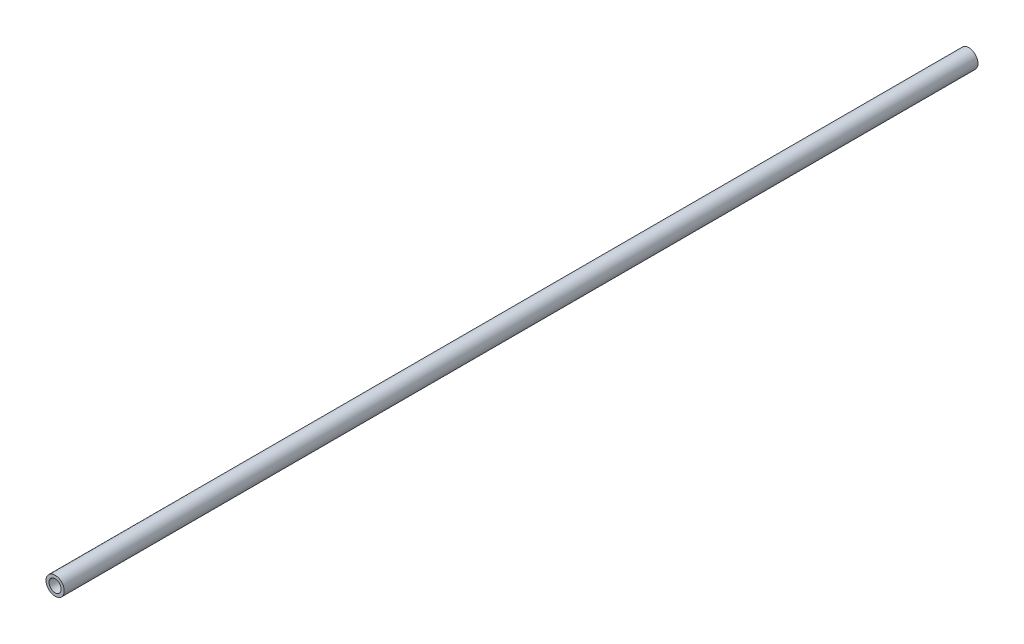
ISO-10303-21;
HEADER;
FILE_DESCRIPTION(('STEP AP214'),'2;1');
FILE_NAME('part.step','',(''),(''),'','','');
FILE_SCHEMA(('AUTOMOTIVE_DESIGN { 1 0 10303 214 1 1 1 1 }'));
ENDSEC;
DATA;
#1=APPLICATION_CONTEXT('core data for automotive mechanical design processes');
#2=APPLICATION_PROTOCOL_DEFINITION('international standard','automotive_design',2000,#1);
#3=PRODUCT_CONTEXT('',#1,'mechanical');
#4=PRODUCT('Part','Part','',(#3));
#5=PRODUCT_RELATED_PRODUCT_CATEGORY('part','',(#4));
#6=PRODUCT_DEFINITION_FORMATION('','',#4);
#7=PRODUCT_DEFINITION_CONTEXT('part definition',#1,'design');
#8=PRODUCT_DEFINITION('design','',#6,#7);
#9=PRODUCT_DEFINITION_SHAPE('','',#8);
#10=(LENGTH_UNIT() NAMED_UNIT(*) SI_UNIT(.MILLI.,.METRE.));
#11=(NAMED_UNIT(*) PLANE_ANGLE_UNIT() SI_UNIT($,.RADIAN.));
#12=(NAMED_UNIT(*) SI_UNIT($,.STERADIAN.) SOLID_ANGLE_UNIT());
#13=UNCERTAINTY_MEASURE_WITH_UNIT(LENGTH_MEASURE(1.E-05),#10,'distance_accuracy_value','');
#14=(GEOMETRIC_REPRESENTATION_CONTEXT(3) GLOBAL_UNCERTAINTY_ASSIGNED_CONTEXT((#13)) GLOBAL_UNIT_ASSIGNED_CONTEXT((#10,
#11,#12)) REPRESENTATION_CONTEXT('',''));
#15=CARTESIAN_POINT('',(0.,0.,0.));
#16=DIRECTION('',(0.,0.,1.));
#17=DIRECTION('',(1.,0.,0.));
#18=AXIS2_PLACEMENT_3D('',#15,#16,#17);
#19=CARTESIAN_POINT('',(0.,0.,300.));
#20=DIRECTION('',(0.,0.,1.));
#21=DIRECTION('',(1.,0.,0.));
#22=AXIS2_PLACEMENT_3D('',#19,#20,#21);
#23=PLANE('',#22);
#24=CARTESIAN_POINT('',(0.,0.,300.));
#25=DIRECTION('',(0.,0.,1.));
#26=DIRECTION('',(1.,0.,0.));
#27=AXIS2_PLACEMENT_3D('',#24,#25,#26);
#28=CIRCLE('',#27,3.);
#29=CARTESIAN_POINT('',(3.,0.,300.));
#30=VERTEX_POINT('',#29);
#31=EDGE_CURVE('E10',#30,#30,#28,.T.);
#32=ORIENTED_EDGE('',*,*,#31,.T.);
#33=EDGE_LOOP('',(#32));
#34=FACE_BOUND('',#33,.T.);
#35=CARTESIAN_POINT('',(0.,0.,300.));
#36=DIRECTION('',(0.,0.,1.));
#37=DIRECTION('',(1.,0.,0.));
#38=AXIS2_PLACEMENT_3D('',#35,#36,#37);
#39=CIRCLE('',#38,2.);
#40=CARTESIAN_POINT('',(2.,0.,300.));
#41=VERTEX_POINT('',#40);
#42=EDGE_CURVE('E43',#41,#41,#39,.T.);
#43=ORIENTED_EDGE('',*,*,#42,.F.);
#44=EDGE_LOOP('',(#43));
#45=FACE_BOUND('',#44,.T.);
#46=ADVANCED_FACE('F32',(#34,#45),#23,.T.);
#47=CARTESIAN_POINT('',(0.,0.,0.));
#48=DIRECTION('',(0.,0.,1.));
#49=DIRECTION('',(1.,0.,0.));
#50=AXIS2_PLACEMENT_3D('',#47,#48,#49);
#51=PLANE('',#50);
#52=CARTESIAN_POINT('',(0.,0.,0.));
#53=DIRECTION('',(0.,0.,1.));
#54=DIRECTION('',(1.,0.,0.));
#55=AXIS2_PLACEMENT_3D('',#52,#53,#54);
#56=CIRCLE('',#55,3.);
#57=CARTESIAN_POINT('',(3.,0.,0.));
#58=VERTEX_POINT('',#57);
#59=EDGE_CURVE('E36',#58,#58,#56,.T.);
#60=ORIENTED_EDGE('',*,*,#59,.F.);
#61=EDGE_LOOP('',(#60));
#62=FACE_BOUND('',#61,.T.);
#63=CARTESIAN_POINT('',(0.,0.,0.));
#64=DIRECTION('',(0.,0.,1.));
#65=DIRECTION('',(1.,0.,0.));
#66=AXIS2_PLACEMENT_3D('',#63,#64,#65);
#67=CIRCLE('',#66,2.);
#68=CARTESIAN_POINT('',(2.,0.,0.));
#69=VERTEX_POINT('',#68);
#70=EDGE_CURVE('E45',#69,#69,#67,.T.);
#71=ORIENTED_EDGE('',*,*,#70,.T.);
#72=EDGE_LOOP('',(#71));
#73=FACE_BOUND('',#72,.T.);
#74=ADVANCED_FACE('F55',(#62,#73),#51,.F.);
#75=CARTESIAN_POINT('',(0.,0.,300.));
#76=DIRECTION('',(0.,0.,-1.));
#77=DIRECTION('',(-1.,0.,0.));
#78=AXIS2_PLACEMENT_3D('',#75,#76,#77);
#79=CYLINDRICAL_SURFACE('',#78,3.);
#80=ORIENTED_EDGE('',*,*,#31,.F.);
#81=EDGE_LOOP('',(#80));
#82=FACE_BOUND('',#81,.T.);
#83=ORIENTED_EDGE('',*,*,#59,.T.);
#84=EDGE_LOOP('',(#83));
#85=FACE_BOUND('',#84,.T.);
#86=ADVANCED_FACE('F34',(#82,#85),#79,.T.);
#87=CARTESIAN_POINT('',(0.,0.,300.));
#88=DIRECTION('',(0.,0.,-1.));
#89=DIRECTION('',(-1.,0.,0.));
#90=AXIS2_PLACEMENT_3D('',#87,#88,#89);
#91=CYLINDRICAL_SURFACE('',#90,2.);
#92=ORIENTED_EDGE('',*,*,#42,.T.);
#93=EDGE_LOOP('',(#92));
#94=FACE_BOUND('',#93,.T.);
#95=ORIENTED_EDGE('',*,*,#70,.F.);
#96=EDGE_LOOP('',(#95));
#97=FACE_BOUND('',#96,.T.);
#98=ADVANCED_FACE('F51',(#94,#97),#91,.F.);
#99=CLOSED_SHELL('',(#46,#74,#86,#98));
#100=MANIFOLD_SOLID_BREP('B2',#99);
#101=ADVANCED_BREP_SHAPE_REPRESENTATION('',(#18,#100),#14);
#102=SHAPE_DEFINITION_REPRESENTATION(#9,#101);
ENDSEC;
END-ISO-10303-21;
